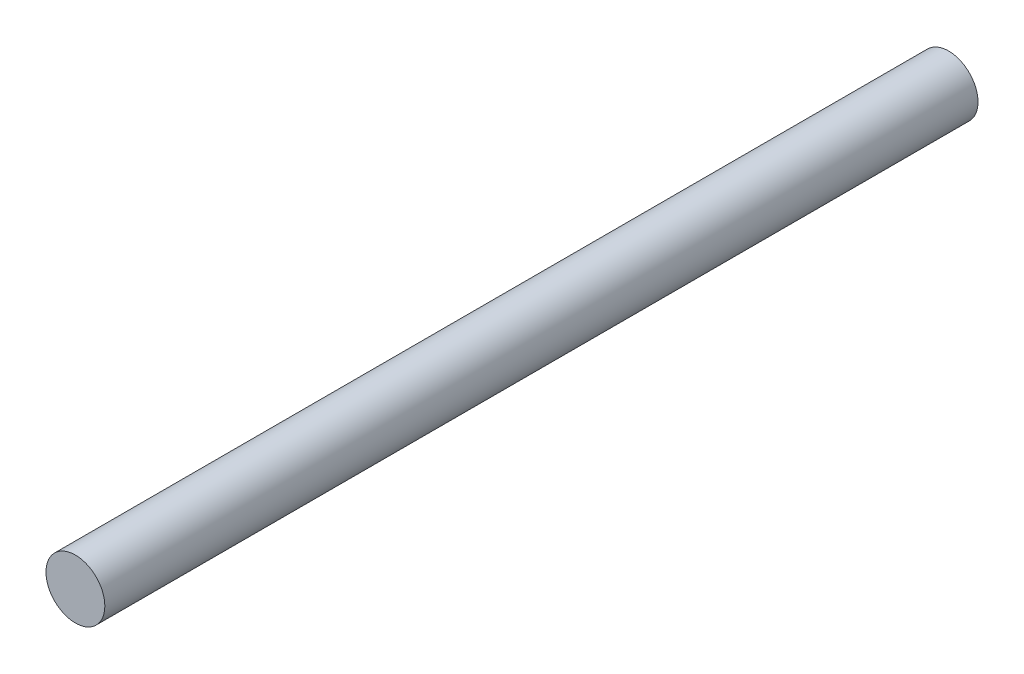
ISO-10303-21;
HEADER;
FILE_DESCRIPTION(('STEP AP214'),'2;1');
FILE_NAME('part.step','',(''),(''),'','','');
FILE_SCHEMA(('AUTOMOTIVE_DESIGN { 1 0 10303 214 1 1 1 1 }'));
ENDSEC;
DATA;
#1=APPLICATION_CONTEXT('core data for automotive mechanical design processes');
#2=APPLICATION_PROTOCOL_DEFINITION('international standard','automotive_design',2000,#1);
#3=PRODUCT_CONTEXT('',#1,'mechanical');
#4=PRODUCT('Part','Part','',(#3));
#5=PRODUCT_RELATED_PRODUCT_CATEGORY('part','',(#4));
#6=PRODUCT_DEFINITION_FORMATION('','',#4);
#7=PRODUCT_DEFINITION_CONTEXT('part definition',#1,'design');
#8=PRODUCT_DEFINITION('design','',#6,#7);
#9=PRODUCT_DEFINITION_SHAPE('','',#8);
#10=(LENGTH_UNIT() NAMED_UNIT(*) SI_UNIT(.MILLI.,.METRE.));
#11=(NAMED_UNIT(*) PLANE_ANGLE_UNIT() SI_UNIT($,.RADIAN.));
#12=(NAMED_UNIT(*) SI_UNIT($,.STERADIAN.) SOLID_ANGLE_UNIT());
#13=UNCERTAINTY_MEASURE_WITH_UNIT(LENGTH_MEASURE(1.E-05),#10,'distance_accuracy_value','');
#14=(GEOMETRIC_REPRESENTATION_CONTEXT(3) GLOBAL_UNCERTAINTY_ASSIGNED_CONTEXT((#13)) GLOBAL_UNIT_ASSIGNED_CONTEXT((#10,
#11,#12)) REPRESENTATION_CONTEXT('',''));
#15=CARTESIAN_POINT('',(0.,0.,0.));
#16=DIRECTION('',(0.,0.,1.));
#17=DIRECTION('',(1.,0.,0.));
#18=AXIS2_PLACEMENT_3D('',#15,#16,#17);
#19=CARTESIAN_POINT('',(0.,0.,296.5));
#20=DIRECTION('',(0.,0.,-1.));
#21=DIRECTION('',(-1.,0.,0.));
#22=AXIS2_PLACEMENT_3D('',#19,#20,#21);
#23=CYLINDRICAL_SURFACE('',#22,10.);
#24=CARTESIAN_POINT('',(0.,0.,296.5));
#25=DIRECTION('',(0.,0.,1.));
#26=DIRECTION('',(1.,0.,0.));
#27=AXIS2_PLACEMENT_3D('',#24,#25,#26);
#28=CIRCLE('',#27,10.);
#29=CARTESIAN_POINT('',(10.,0.,296.5));
#30=VERTEX_POINT('',#29);
#31=EDGE_CURVE('E10',#30,#30,#28,.T.);
#32=ORIENTED_EDGE('',*,*,#31,.F.);
#33=EDGE_LOOP('',(#32));
#34=FACE_BOUND('',#33,.T.);
#35=CARTESIAN_POINT('',(0.,0.,0.));
#36=DIRECTION('',(0.,0.,1.));
#37=DIRECTION('',(1.,0.,0.));
#38=AXIS2_PLACEMENT_3D('',#35,#36,#37);
#39=CIRCLE('',#38,10.);
#40=CARTESIAN_POINT('',(10.,0.,0.));
#41=VERTEX_POINT('',#40);
#42=EDGE_CURVE('E34',#41,#41,#39,.T.);
#43=ORIENTED_EDGE('',*,*,#42,.T.);
#44=EDGE_LOOP('',(#43));
#45=FACE_BOUND('',#44,.T.);
#46=ADVANCED_FACE('F31',(#34,#45),#23,.T.);
#47=CARTESIAN_POINT('',(0.,0.,296.5));
#48=DIRECTION('',(0.,0.,1.));
#49=DIRECTION('',(1.,0.,0.));
#50=AXIS2_PLACEMENT_3D('',#47,#48,#49);
#51=PLANE('',#50);
#52=ORIENTED_EDGE('',*,*,#31,.T.);
#53=EDGE_LOOP('',(#52));
#54=FACE_BOUND('',#53,.T.);
#55=ADVANCED_FACE('F46',(#54),#51,.T.);
#56=CARTESIAN_POINT('',(0.,0.,0.));
#57=DIRECTION('',(0.,0.,1.));
#58=DIRECTION('',(1.,0.,0.));
#59=AXIS2_PLACEMENT_3D('',#56,#57,#58);
#60=PLANE('',#59);
#61=ORIENTED_EDGE('',*,*,#42,.F.);
#62=EDGE_LOOP('',(#61));
#63=FACE_BOUND('',#62,.T.);
#64=ADVANCED_FACE('F44',(#63),#60,.F.);
#65=CLOSED_SHELL('',(#46,#55,#64));
#66=MANIFOLD_SOLID_BREP('B2',#65);
#67=ADVANCED_BREP_SHAPE_REPRESENTATION('',(#18,#66),#14);
#68=SHAPE_DEFINITION_REPRESENTATION(#9,#67);
ENDSEC;
END-ISO-10303-21;
